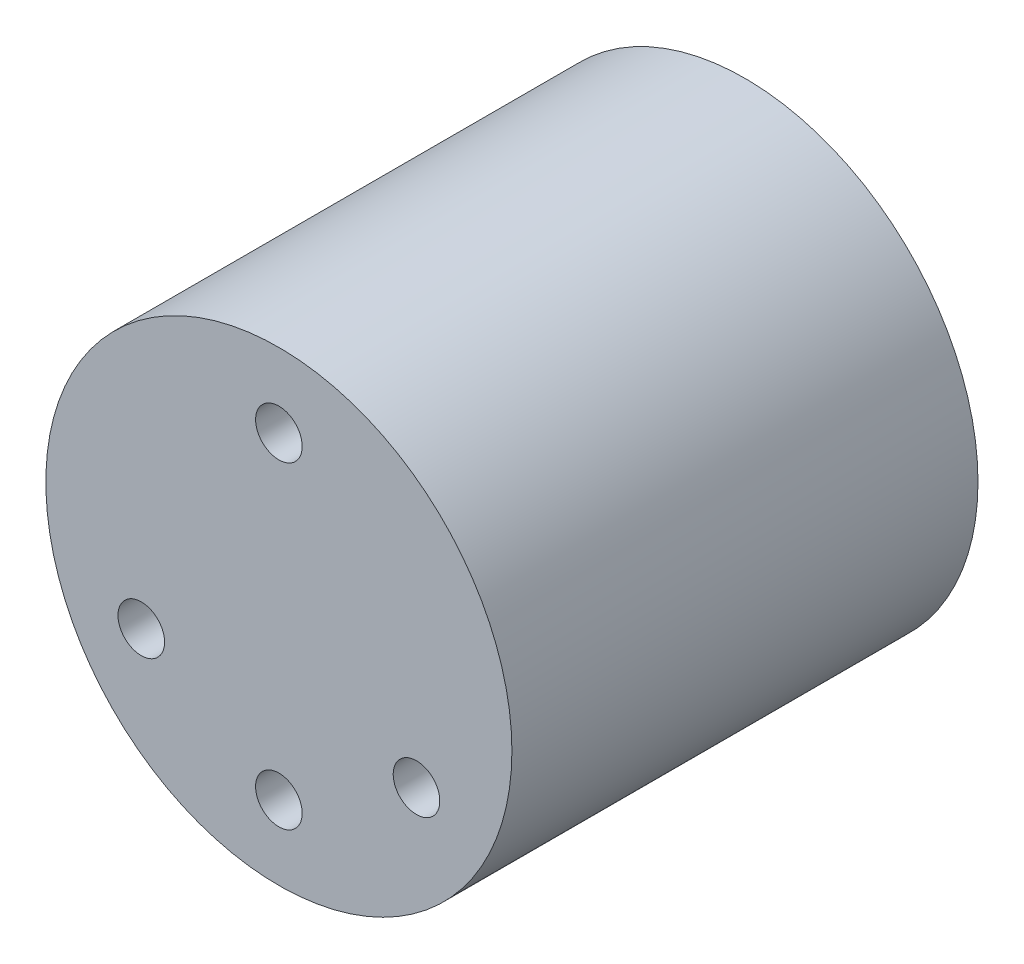
ISO-10303-21;
HEADER;
FILE_DESCRIPTION(('STEP AP214'),'2;1');
FILE_NAME('part.step','',(''),(''),'','','');
FILE_SCHEMA(('AUTOMOTIVE_DESIGN { 1 0 10303 214 1 1 1 1 }'));
ENDSEC;
DATA;
#1=APPLICATION_CONTEXT('core data for automotive mechanical design processes');
#2=APPLICATION_PROTOCOL_DEFINITION('international standard','automotive_design',2000,#1);
#3=PRODUCT_CONTEXT('',#1,'mechanical');
#4=PRODUCT('Part','Part','',(#3));
#5=PRODUCT_RELATED_PRODUCT_CATEGORY('part','',(#4));
#6=PRODUCT_DEFINITION_FORMATION('','',#4);
#7=PRODUCT_DEFINITION_CONTEXT('part definition',#1,'design');
#8=PRODUCT_DEFINITION('design','',#6,#7);
#9=PRODUCT_DEFINITION_SHAPE('','',#8);
#10=(LENGTH_UNIT() NAMED_UNIT(*) SI_UNIT(.MILLI.,.METRE.));
#11=(NAMED_UNIT(*) PLANE_ANGLE_UNIT() SI_UNIT($,.RADIAN.));
#12=(NAMED_UNIT(*) SI_UNIT($,.STERADIAN.) SOLID_ANGLE_UNIT());
#13=UNCERTAINTY_MEASURE_WITH_UNIT(LENGTH_MEASURE(1.E-05),#10,'distance_accuracy_value','');
#14=(GEOMETRIC_REPRESENTATION_CONTEXT(3) GLOBAL_UNCERTAINTY_ASSIGNED_CONTEXT((#13)) GLOBAL_UNIT_ASSIGNED_CONTEXT((#10,
#11,#12)) REPRESENTATION_CONTEXT('',''));
#15=CARTESIAN_POINT('',(0.,0.,0.));
#16=DIRECTION('',(0.,0.,1.));
#17=DIRECTION('',(1.,0.,0.));
#18=AXIS2_PLACEMENT_3D('',#15,#16,#17);
#19=CARTESIAN_POINT('',(0.,0.,22.));
#20=DIRECTION('',(0.,0.,1.));
#21=DIRECTION('',(1.,0.,0.));
#22=AXIS2_PLACEMENT_3D('',#19,#20,#21);
#23=PLANE('',#22);
#24=CARTESIAN_POINT('',(-6.4951905283833,-3.74999999999998,22.));
#25=DIRECTION('',(0.,0.,1.));
#26=DIRECTION('',(1.,0.,0.));
#27=AXIS2_PLACEMENT_3D('',#24,#25,#26);
#28=CIRCLE('',#27,1.1);
#29=CARTESIAN_POINT('',(-5.3951905283833,-3.74999999999998,22.));
#30=VERTEX_POINT('',#29);
#31=EDGE_CURVE('E64',#30,#30,#28,.T.);
#32=ORIENTED_EDGE('',*,*,#31,.F.);
#33=EDGE_LOOP('',(#32));
#34=FACE_BOUND('',#33,.T.);
#35=CARTESIAN_POINT('',(0.,7.5,22.));
#36=DIRECTION('',(0.,0.,1.));
#37=DIRECTION('',(1.,0.,0.));
#38=AXIS2_PLACEMENT_3D('',#35,#36,#37);
#39=CIRCLE('',#38,1.1);
#40=CARTESIAN_POINT('',(1.1,7.5,22.));
#41=VERTEX_POINT('',#40);
#42=EDGE_CURVE('E50',#41,#41,#39,.T.);
#43=ORIENTED_EDGE('',*,*,#42,.F.);
#44=EDGE_LOOP('',(#43));
#45=FACE_BOUND('',#44,.T.);
#46=CARTESIAN_POINT('',(0.,0.,22.));
#47=DIRECTION('',(0.,0.,1.));
#48=DIRECTION('',(1.,0.,0.));
#49=AXIS2_PLACEMENT_3D('',#46,#47,#48);
#50=CIRCLE('',#49,11.);
#51=CARTESIAN_POINT('',(11.,0.,22.));
#52=VERTEX_POINT('',#51);
#53=EDGE_CURVE('E10',#52,#52,#50,.T.);
#54=ORIENTED_EDGE('',*,*,#53,.T.);
#55=EDGE_LOOP('',(#54));
#56=FACE_BOUND('',#55,.T.);
#57=CARTESIAN_POINT('',(0.,-7.5,22.));
#58=DIRECTION('',(0.,0.,1.));
#59=DIRECTION('',(1.,0.,0.));
#60=AXIS2_PLACEMENT_3D('',#57,#58,#59);
#61=CIRCLE('',#60,1.1);
#62=CARTESIAN_POINT('',(1.1,-7.5,22.));
#63=VERTEX_POINT('',#62);
#64=EDGE_CURVE('E56',#63,#63,#61,.T.);
#65=ORIENTED_EDGE('',*,*,#64,.F.);
#66=EDGE_LOOP('',(#65));
#67=FACE_BOUND('',#66,.T.);
#68=CARTESIAN_POINT('',(6.4951905283833,-3.74999999999998,22.));
#69=DIRECTION('',(0.,0.,1.));
#70=DIRECTION('',(-1.,0.,0.));
#71=AXIS2_PLACEMENT_3D('',#68,#69,#70);
#72=CIRCLE('',#71,1.1);
#73=CARTESIAN_POINT('',(5.3951905283833,-3.74999999999998,22.));
#74=VERTEX_POINT('',#73);
#75=EDGE_CURVE('E72',#74,#74,#72,.T.);
#76=ORIENTED_EDGE('',*,*,#75,.F.);
#77=EDGE_LOOP('',(#76));
#78=FACE_BOUND('',#77,.T.);
#79=ADVANCED_FACE('F37',(#34,#45,#56,#67,#78),#23,.T.);
#80=CARTESIAN_POINT('',(0.,0.,0.));
#81=DIRECTION('',(0.,0.,1.));
#82=DIRECTION('',(1.,0.,0.));
#83=AXIS2_PLACEMENT_3D('',#80,#81,#82);
#84=PLANE('',#83);
#85=CARTESIAN_POINT('',(0.,0.,0.));
#86=DIRECTION('',(0.,0.,1.));
#87=DIRECTION('',(1.,0.,0.));
#88=AXIS2_PLACEMENT_3D('',#85,#86,#87);
#89=CIRCLE('',#88,11.);
#90=CARTESIAN_POINT('',(11.,0.,0.));
#91=VERTEX_POINT('',#90);
#92=EDGE_CURVE('E41',#91,#91,#89,.T.);
#93=ORIENTED_EDGE('',*,*,#92,.F.);
#94=EDGE_LOOP('',(#93));
#95=FACE_BOUND('',#94,.T.);
#96=CARTESIAN_POINT('',(0.,7.5,0.));
#97=DIRECTION('',(0.,0.,1.));
#98=DIRECTION('',(1.,0.,0.));
#99=AXIS2_PLACEMENT_3D('',#96,#97,#98);
#100=CIRCLE('',#99,1.1);
#101=CARTESIAN_POINT('',(1.1,7.5,0.));
#102=VERTEX_POINT('',#101);
#103=EDGE_CURVE('E52',#102,#102,#100,.T.);
#104=ORIENTED_EDGE('',*,*,#103,.T.);
#105=EDGE_LOOP('',(#104));
#106=FACE_BOUND('',#105,.T.);
#107=CARTESIAN_POINT('',(0.,-7.5,0.));
#108=DIRECTION('',(0.,0.,1.));
#109=DIRECTION('',(1.,0.,0.));
#110=AXIS2_PLACEMENT_3D('',#107,#108,#109);
#111=CIRCLE('',#110,1.1);
#112=CARTESIAN_POINT('',(1.1,-7.5,0.));
#113=VERTEX_POINT('',#112);
#114=EDGE_CURVE('E60',#113,#113,#111,.T.);
#115=ORIENTED_EDGE('',*,*,#114,.T.);
#116=EDGE_LOOP('',(#115));
#117=FACE_BOUND('',#116,.T.);
#118=CARTESIAN_POINT('',(-6.4951905283833,-3.74999999999998,0.));
#119=DIRECTION('',(0.,0.,1.));
#120=DIRECTION('',(1.,0.,0.));
#121=AXIS2_PLACEMENT_3D('',#118,#119,#120);
#122=CIRCLE('',#121,1.1);
#123=CARTESIAN_POINT('',(-5.3951905283833,-3.74999999999998,0.));
#124=VERTEX_POINT('',#123);
#125=EDGE_CURVE('E68',#124,#124,#122,.T.);
#126=ORIENTED_EDGE('',*,*,#125,.T.);
#127=EDGE_LOOP('',(#126));
#128=FACE_BOUND('',#127,.T.);
#129=CARTESIAN_POINT('',(6.4951905283833,-3.74999999999998,0.));
#130=DIRECTION('',(0.,0.,1.));
#131=DIRECTION('',(-1.,0.,0.));
#132=AXIS2_PLACEMENT_3D('',#129,#130,#131);
#133=CIRCLE('',#132,1.1);
#134=CARTESIAN_POINT('',(5.3951905283833,-3.74999999999998,0.));
#135=VERTEX_POINT('',#134);
#136=EDGE_CURVE('E76',#135,#135,#133,.T.);
#137=ORIENTED_EDGE('',*,*,#136,.T.);
#138=EDGE_LOOP('',(#137));
#139=FACE_BOUND('',#138,.T.);
#140=ADVANCED_FACE('F88',(#95,#106,#117,#128,#139),#84,.F.);
#141=CARTESIAN_POINT('',(0.,0.,22.));
#142=DIRECTION('',(0.,0.,-1.));
#143=DIRECTION('',(-1.,0.,0.));
#144=AXIS2_PLACEMENT_3D('',#141,#142,#143);
#145=CYLINDRICAL_SURFACE('',#144,11.);
#146=ORIENTED_EDGE('',*,*,#53,.F.);
#147=EDGE_LOOP('',(#146));
#148=FACE_BOUND('',#147,.T.);
#149=ORIENTED_EDGE('',*,*,#92,.T.);
#150=EDGE_LOOP('',(#149));
#151=FACE_BOUND('',#150,.T.);
#152=ADVANCED_FACE('F39',(#148,#151),#145,.T.);
#153=CARTESIAN_POINT('',(0.,7.5,22.));
#154=DIRECTION('',(0.,0.,-1.));
#155=DIRECTION('',(-1.,0.,0.));
#156=AXIS2_PLACEMENT_3D('',#153,#154,#155);
#157=CYLINDRICAL_SURFACE('',#156,1.1);
#158=ORIENTED_EDGE('',*,*,#42,.T.);
#159=EDGE_LOOP('',(#158));
#160=FACE_BOUND('',#159,.T.);
#161=ORIENTED_EDGE('',*,*,#103,.F.);
#162=EDGE_LOOP('',(#161));
#163=FACE_BOUND('',#162,.T.);
#164=ADVANCED_FACE('F98',(#160,#163),#157,.F.);
#165=CARTESIAN_POINT('',(0.,-7.5,22.));
#166=DIRECTION('',(0.,0.,-1.));
#167=DIRECTION('',(-1.,0.,0.));
#168=AXIS2_PLACEMENT_3D('',#165,#166,#167);
#169=CYLINDRICAL_SURFACE('',#168,1.1);
#170=ORIENTED_EDGE('',*,*,#64,.T.);
#171=EDGE_LOOP('',(#170));
#172=FACE_BOUND('',#171,.T.);
#173=ORIENTED_EDGE('',*,*,#114,.F.);
#174=EDGE_LOOP('',(#173));
#175=FACE_BOUND('',#174,.T.);
#176=ADVANCED_FACE('F101',(#172,#175),#169,.F.);
#177=CARTESIAN_POINT('',(-6.4951905283833,-3.74999999999998,22.));
#178=DIRECTION('',(0.,0.,-1.));
#179=DIRECTION('',(-1.,0.,0.));
#180=AXIS2_PLACEMENT_3D('',#177,#178,#179);
#181=CYLINDRICAL_SURFACE('',#180,1.1);
#182=ORIENTED_EDGE('',*,*,#31,.T.);
#183=EDGE_LOOP('',(#182));
#184=FACE_BOUND('',#183,.T.);
#185=ORIENTED_EDGE('',*,*,#125,.F.);
#186=EDGE_LOOP('',(#185));
#187=FACE_BOUND('',#186,.T.);
#188=ADVANCED_FACE('F105',(#184,#187),#181,.F.);
#189=CARTESIAN_POINT('',(6.4951905283833,-3.74999999999998,22.));
#190=DIRECTION('',(0.,0.,-1.));
#191=DIRECTION('',(-1.,0.,0.));
#192=AXIS2_PLACEMENT_3D('',#189,#190,#191);
#193=CYLINDRICAL_SURFACE('',#192,1.1);
#194=ORIENTED_EDGE('',*,*,#75,.T.);
#195=EDGE_LOOP('',(#194));
#196=FACE_BOUND('',#195,.T.);
#197=ORIENTED_EDGE('',*,*,#136,.F.);
#198=EDGE_LOOP('',(#197));
#199=FACE_BOUND('',#198,.T.);
#200=ADVANCED_FACE('F84',(#196,#199),#193,.F.);
#201=CLOSED_SHELL('',(#79,#140,#152,#164,#176,#188,#200));
#202=MANIFOLD_SOLID_BREP('B2',#201);
#203=ADVANCED_BREP_SHAPE_REPRESENTATION('',(#18,#202),#14);
#204=SHAPE_DEFINITION_REPRESENTATION(#9,#203);
ENDSEC;
END-ISO-10303-21;
